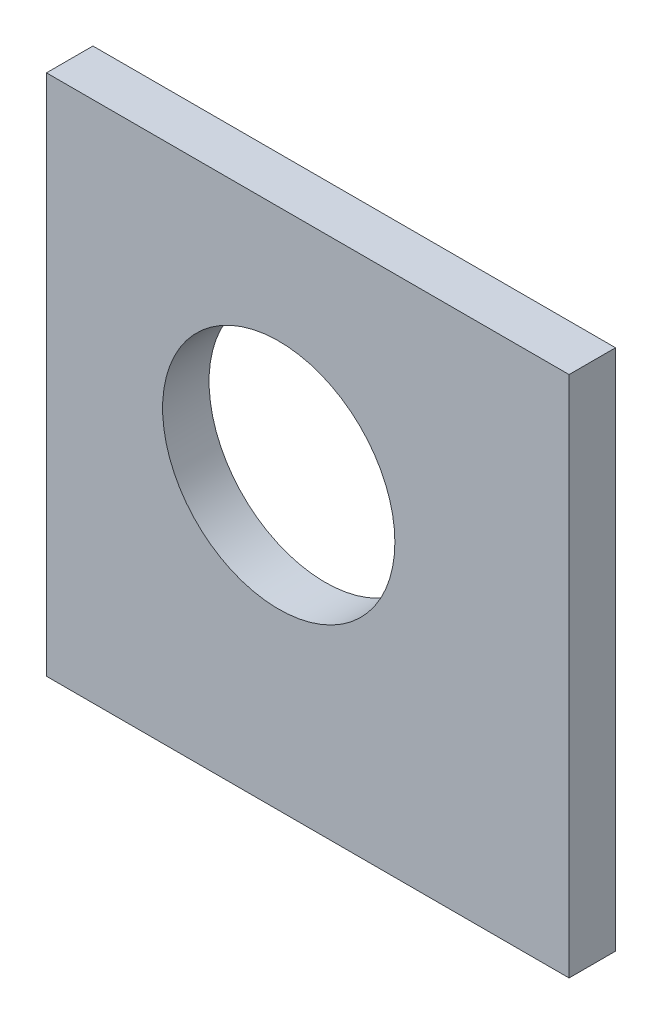
ISO-10303-21;
HEADER;
FILE_DESCRIPTION(('STEP AP214'),'2;1');
FILE_NAME('part.step','',(''),(''),'','','');
FILE_SCHEMA(('AUTOMOTIVE_DESIGN { 1 0 10303 214 1 1 1 1 }'));
ENDSEC;
DATA;
#1=APPLICATION_CONTEXT('core data for automotive mechanical design processes');
#2=APPLICATION_PROTOCOL_DEFINITION('international standard','automotive_design',2000,#1);
#3=PRODUCT_CONTEXT('',#1,'mechanical');
#4=PRODUCT('Part','Part','',(#3));
#5=PRODUCT_RELATED_PRODUCT_CATEGORY('part','',(#4));
#6=PRODUCT_DEFINITION_FORMATION('','',#4);
#7=PRODUCT_DEFINITION_CONTEXT('part definition',#1,'design');
#8=PRODUCT_DEFINITION('design','',#6,#7);
#9=PRODUCT_DEFINITION_SHAPE('','',#8);
#10=(LENGTH_UNIT() NAMED_UNIT(*) SI_UNIT(.MILLI.,.METRE.));
#11=(NAMED_UNIT(*) PLANE_ANGLE_UNIT() SI_UNIT($,.RADIAN.));
#12=(NAMED_UNIT(*) SI_UNIT($,.STERADIAN.) SOLID_ANGLE_UNIT());
#13=UNCERTAINTY_MEASURE_WITH_UNIT(LENGTH_MEASURE(1.E-05),#10,'distance_accuracy_value','');
#14=(GEOMETRIC_REPRESENTATION_CONTEXT(3) GLOBAL_UNCERTAINTY_ASSIGNED_CONTEXT((#13)) GLOBAL_UNIT_ASSIGNED_CONTEXT((#10,
#11,#12)) REPRESENTATION_CONTEXT('',''));
#15=CARTESIAN_POINT('',(0.,0.,0.));
#16=DIRECTION('',(0.,0.,1.));
#17=DIRECTION('',(1.,0.,0.));
#18=AXIS2_PLACEMENT_3D('',#15,#16,#17);
#19=CARTESIAN_POINT('',(0.,0.,2.));
#20=DIRECTION('',(0.,0.,-1.));
#21=DIRECTION('',(-1.,0.,0.));
#22=AXIS2_PLACEMENT_3D('',#19,#20,#21);
#23=PLANE('',#22);
#24=DIRECTION('',(0.,1.,0.));
#25=VECTOR('',#24,1.);
#26=CARTESIAN_POINT('',(11.3135593220339,7.06214689265537,2.));
#27=LINE('',#26,#25);
#28=CARTESIAN_POINT('',(11.3135593220339,-15.4378531073446,2.));
#29=VERTEX_POINT('',#28);
#30=CARTESIAN_POINT('',(11.3135593220339,7.06214689265537,2.));
#31=VERTEX_POINT('',#30);
#32=EDGE_CURVE('E96',#29,#31,#27,.T.);
#33=ORIENTED_EDGE('',*,*,#32,.T.);
#34=DIRECTION('',(-1.,0.,0.));
#35=VECTOR('',#34,1.);
#36=CARTESIAN_POINT('',(11.3135593220339,7.06214689265537,2.));
#37=LINE('',#36,#35);
#38=CARTESIAN_POINT('',(-11.1864406779661,7.06214689265536,2.));
#39=VERTEX_POINT('',#38);
#40=EDGE_CURVE('E91',#31,#39,#37,.T.);
#41=ORIENTED_EDGE('',*,*,#40,.T.);
#42=DIRECTION('',(0.,-1.,0.));
#43=VECTOR('',#42,1.);
#44=CARTESIAN_POINT('',(-11.1864406779661,7.06214689265536,2.));
#45=LINE('',#44,#43);
#46=CARTESIAN_POINT('',(-11.1864406779661,-15.4378531073446,2.));
#47=VERTEX_POINT('',#46);
#48=EDGE_CURVE('E94',#39,#47,#45,.T.);
#49=ORIENTED_EDGE('',*,*,#48,.T.);
#50=DIRECTION('',(1.,0.,0.));
#51=VECTOR('',#50,1.);
#52=CARTESIAN_POINT('',(11.3135593220339,-15.4378531073446,2.));
#53=LINE('',#52,#51);
#54=EDGE_CURVE('E61',#47,#29,#53,.T.);
#55=ORIENTED_EDGE('',*,*,#54,.T.);
#56=EDGE_LOOP('',(#33,#41,#49,#55));
#57=FACE_BOUND('',#56,.T.);
#58=CARTESIAN_POINT('',(-1.1864406779661,-2.93785310734464,2.));
#59=DIRECTION('',(0.,0.,1.));
#60=DIRECTION('',(1.,0.,0.));
#61=AXIS2_PLACEMENT_3D('',#58,#59,#60);
#62=CIRCLE('',#61,5.);
#63=CARTESIAN_POINT('',(3.8135593220339,-2.93785310734464,2.));
#64=VERTEX_POINT('',#63);
#65=EDGE_CURVE('E111',#64,#64,#62,.T.);
#66=ORIENTED_EDGE('',*,*,#65,.F.);
#67=EDGE_LOOP('',(#66));
#68=FACE_BOUND('',#67,.T.);
#69=ADVANCED_FACE('F44',(#57,#68),#23,.F.);
#70=CARTESIAN_POINT('',(0.,0.,0.));
#71=DIRECTION('',(0.,0.,-1.));
#72=DIRECTION('',(-1.,0.,0.));
#73=AXIS2_PLACEMENT_3D('',#70,#71,#72);
#74=PLANE('',#73);
#75=DIRECTION('',(0.,1.,0.));
#76=VECTOR('',#75,1.);
#77=CARTESIAN_POINT('',(11.3135593220339,7.06214689265537,0.));
#78=LINE('',#77,#76);
#79=CARTESIAN_POINT('',(11.3135593220339,-15.4378531073446,0.));
#80=VERTEX_POINT('',#79);
#81=CARTESIAN_POINT('',(11.3135593220339,7.06214689265537,0.));
#82=VERTEX_POINT('',#81);
#83=EDGE_CURVE('E108',#80,#82,#78,.T.);
#84=ORIENTED_EDGE('',*,*,#83,.F.);
#85=DIRECTION('',(1.,0.,0.));
#86=VECTOR('',#85,1.);
#87=CARTESIAN_POINT('',(11.3135593220339,-15.4378531073446,0.));
#88=LINE('',#87,#86);
#89=CARTESIAN_POINT('',(-11.1864406779661,-15.4378531073446,0.));
#90=VERTEX_POINT('',#89);
#91=EDGE_CURVE('E84',#90,#80,#88,.T.);
#92=ORIENTED_EDGE('',*,*,#91,.F.);
#93=DIRECTION('',(0.,-1.,0.));
#94=VECTOR('',#93,1.);
#95=CARTESIAN_POINT('',(-11.1864406779661,7.06214689265536,0.));
#96=LINE('',#95,#94);
#97=CARTESIAN_POINT('',(-11.1864406779661,7.06214689265536,0.));
#98=VERTEX_POINT('',#97);
#99=EDGE_CURVE('E78',#98,#90,#96,.T.);
#100=ORIENTED_EDGE('',*,*,#99,.F.);
#101=DIRECTION('',(-1.,0.,0.));
#102=VECTOR('',#101,1.);
#103=CARTESIAN_POINT('',(11.3135593220339,7.06214689265537,0.));
#104=LINE('',#103,#102);
#105=EDGE_CURVE('E100',#82,#98,#104,.T.);
#106=ORIENTED_EDGE('',*,*,#105,.F.);
#107=EDGE_LOOP('',(#84,#92,#100,#106));
#108=FACE_BOUND('',#107,.T.);
#109=CARTESIAN_POINT('',(-1.1864406779661,-2.93785310734464,0.));
#110=DIRECTION('',(0.,0.,1.));
#111=DIRECTION('',(1.,0.,0.));
#112=AXIS2_PLACEMENT_3D('',#109,#110,#111);
#113=CIRCLE('',#112,5.);
#114=CARTESIAN_POINT('',(3.8135593220339,-2.93785310734464,0.));
#115=VERTEX_POINT('',#114);
#116=EDGE_CURVE('E123',#115,#115,#113,.T.);
#117=ORIENTED_EDGE('',*,*,#116,.T.);
#118=EDGE_LOOP('',(#117));
#119=FACE_BOUND('',#118,.T.);
#120=ADVANCED_FACE('F119',(#108,#119),#74,.T.);
#121=CARTESIAN_POINT('',(11.3135593220339,7.06214689265537,2.));
#122=DIRECTION('',(-1.,0.,0.));
#123=DIRECTION('',(0.,-1.,0.));
#124=AXIS2_PLACEMENT_3D('',#121,#122,#123);
#125=PLANE('',#124);
#126=ORIENTED_EDGE('',*,*,#83,.T.);
#127=DIRECTION('',(0.,0.,-1.));
#128=VECTOR('',#127,1.);
#129=CARTESIAN_POINT('',(11.3135593220339,7.06214689265537,2.));
#130=LINE('',#129,#128);
#131=EDGE_CURVE('E13',#31,#82,#130,.T.);
#132=ORIENTED_EDGE('',*,*,#131,.F.);
#133=ORIENTED_EDGE('',*,*,#32,.F.);
#134=DIRECTION('',(0.,0.,-1.));
#135=VECTOR('',#134,1.);
#136=CARTESIAN_POINT('',(11.3135593220339,-15.4378531073446,2.));
#137=LINE('',#136,#135);
#138=EDGE_CURVE('E104',#29,#80,#137,.T.);
#139=ORIENTED_EDGE('',*,*,#138,.T.);
#140=EDGE_LOOP('',(#126,#132,#133,#139));
#141=FACE_BOUND('',#140,.T.);
#142=ADVANCED_FACE('F46',(#141),#125,.F.);
#143=CARTESIAN_POINT('',(11.3135593220339,7.06214689265537,2.));
#144=DIRECTION('',(0.,-1.,0.));
#145=DIRECTION('',(1.,0.,0.));
#146=AXIS2_PLACEMENT_3D('',#143,#144,#145);
#147=PLANE('',#146);
#148=ORIENTED_EDGE('',*,*,#105,.T.);
#149=DIRECTION('',(0.,0.,-1.));
#150=VECTOR('',#149,1.);
#151=CARTESIAN_POINT('',(-11.1864406779661,7.06214689265536,2.));
#152=LINE('',#151,#150);
#153=EDGE_CURVE('E53',#39,#98,#152,.T.);
#154=ORIENTED_EDGE('',*,*,#153,.F.);
#155=ORIENTED_EDGE('',*,*,#40,.F.);
#156=ORIENTED_EDGE('',*,*,#131,.T.);
#157=EDGE_LOOP('',(#148,#154,#155,#156));
#158=FACE_BOUND('',#157,.T.);
#159=ADVANCED_FACE('F99',(#158),#147,.F.);
#160=CARTESIAN_POINT('',(-11.1864406779661,7.06214689265536,2.));
#161=DIRECTION('',(1.,0.,0.));
#162=DIRECTION('',(0.,1.,0.));
#163=AXIS2_PLACEMENT_3D('',#160,#161,#162);
#164=PLANE('',#163);
#165=ORIENTED_EDGE('',*,*,#99,.T.);
#166=DIRECTION('',(0.,0.,-1.));
#167=VECTOR('',#166,1.);
#168=CARTESIAN_POINT('',(-11.1864406779661,-15.4378531073446,2.));
#169=LINE('',#168,#167);
#170=EDGE_CURVE('E101',#47,#90,#169,.T.);
#171=ORIENTED_EDGE('',*,*,#170,.F.);
#172=ORIENTED_EDGE('',*,*,#48,.F.);
#173=ORIENTED_EDGE('',*,*,#153,.T.);
#174=EDGE_LOOP('',(#165,#171,#172,#173));
#175=FACE_BOUND('',#174,.T.);
#176=ADVANCED_FACE('F102',(#175),#164,.F.);
#177=CARTESIAN_POINT('',(11.3135593220339,-15.4378531073446,2.));
#178=DIRECTION('',(0.,1.,0.));
#179=DIRECTION('',(-1.,0.,0.));
#180=AXIS2_PLACEMENT_3D('',#177,#178,#179);
#181=PLANE('',#180);
#182=ORIENTED_EDGE('',*,*,#91,.T.);
#183=ORIENTED_EDGE('',*,*,#138,.F.);
#184=ORIENTED_EDGE('',*,*,#54,.F.);
#185=ORIENTED_EDGE('',*,*,#170,.T.);
#186=EDGE_LOOP('',(#182,#183,#184,#185));
#187=FACE_BOUND('',#186,.T.);
#188=ADVANCED_FACE('F116',(#187),#181,.F.);
#189=CARTESIAN_POINT('',(-1.1864406779661,-2.93785310734464,2.));
#190=DIRECTION('',(0.,0.,-1.));
#191=DIRECTION('',(-1.,0.,0.));
#192=AXIS2_PLACEMENT_3D('',#189,#190,#191);
#193=CYLINDRICAL_SURFACE('',#192,5.);
#194=ORIENTED_EDGE('',*,*,#65,.T.);
#195=EDGE_LOOP('',(#194));
#196=FACE_BOUND('',#195,.T.);
#197=ORIENTED_EDGE('',*,*,#116,.F.);
#198=EDGE_LOOP('',(#197));
#199=FACE_BOUND('',#198,.T.);
#200=ADVANCED_FACE('F129',(#196,#199),#193,.F.);
#201=CLOSED_SHELL('',(#69,#120,#142,#159,#176,#188,#200));
#202=MANIFOLD_SOLID_BREP('B2',#201);
#203=ADVANCED_BREP_SHAPE_REPRESENTATION('',(#18,#202),#14);
#204=SHAPE_DEFINITION_REPRESENTATION(#9,#203);
ENDSEC;
END-ISO-10303-21;
